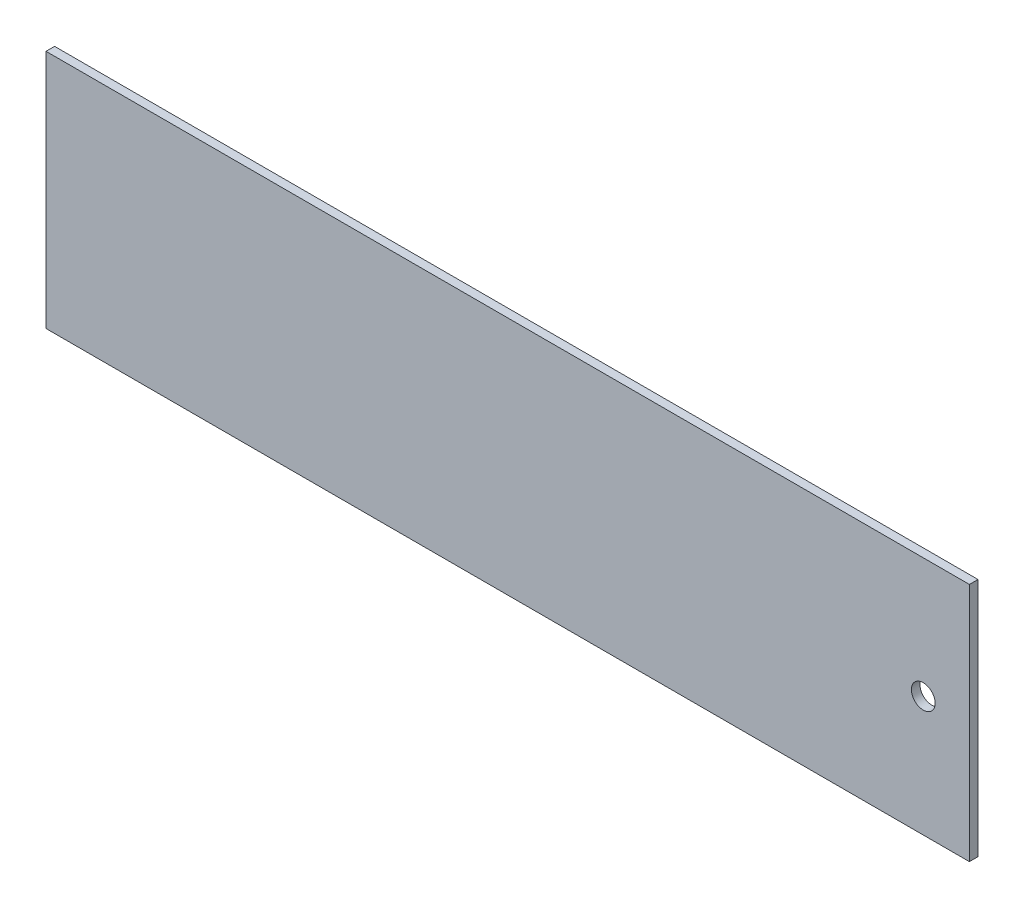
ISO-10303-21;
HEADER;
FILE_DESCRIPTION(('STEP AP214'),'2;1');
FILE_NAME('part.step','',(''),(''),'','','');
FILE_SCHEMA(('AUTOMOTIVE_DESIGN { 1 0 10303 214 1 1 1 1 }'));
ENDSEC;
DATA;
#1=APPLICATION_CONTEXT('core data for automotive mechanical design processes');
#2=APPLICATION_PROTOCOL_DEFINITION('international standard','automotive_design',2000,#1);
#3=PRODUCT_CONTEXT('',#1,'mechanical');
#4=PRODUCT('Part','Part','',(#3));
#5=PRODUCT_RELATED_PRODUCT_CATEGORY('part','',(#4));
#6=PRODUCT_DEFINITION_FORMATION('','',#4);
#7=PRODUCT_DEFINITION_CONTEXT('part definition',#1,'design');
#8=PRODUCT_DEFINITION('design','',#6,#7);
#9=PRODUCT_DEFINITION_SHAPE('','',#8);
#10=(LENGTH_UNIT() NAMED_UNIT(*) SI_UNIT(.MILLI.,.METRE.));
#11=(NAMED_UNIT(*) PLANE_ANGLE_UNIT() SI_UNIT($,.RADIAN.));
#12=(NAMED_UNIT(*) SI_UNIT($,.STERADIAN.) SOLID_ANGLE_UNIT());
#13=UNCERTAINTY_MEASURE_WITH_UNIT(LENGTH_MEASURE(1.E-05),#10,'distance_accuracy_value','');
#14=(GEOMETRIC_REPRESENTATION_CONTEXT(3) GLOBAL_UNCERTAINTY_ASSIGNED_CONTEXT((#13)) GLOBAL_UNIT_ASSIGNED_CONTEXT((#10,
#11,#12)) REPRESENTATION_CONTEXT('',''));
#15=CARTESIAN_POINT('',(0.,0.,0.));
#16=DIRECTION('',(0.,0.,1.));
#17=DIRECTION('',(1.,0.,0.));
#18=AXIS2_PLACEMENT_3D('',#15,#16,#17);
#19=CARTESIAN_POINT('',(0.,0.,2.3622));
#20=DIRECTION('',(-1.,0.,0.));
#21=DIRECTION('',(0.,0.,1.));
#22=AXIS2_PLACEMENT_3D('',#19,#20,#21);
#23=PLANE('',#22);
#24=DIRECTION('',(0.,1.,0.));
#25=VECTOR('',#24,1.);
#26=CARTESIAN_POINT('',(0.,0.,0.));
#27=LINE('',#26,#25);
#28=CARTESIAN_POINT('',(0.,0.,0.));
#29=VERTEX_POINT('',#28);
#30=CARTESIAN_POINT('',(0.,66.04,0.));
#31=VERTEX_POINT('',#30);
#32=EDGE_CURVE('E105',#29,#31,#27,.T.);
#33=ORIENTED_EDGE('',*,*,#32,.T.);
#34=DIRECTION('',(0.,0.,-1.));
#35=VECTOR('',#34,1.);
#36=CARTESIAN_POINT('',(0.,66.04,2.3622));
#37=LINE('',#36,#35);
#38=CARTESIAN_POINT('',(0.,66.04,2.3622));
#39=VERTEX_POINT('',#38);
#40=EDGE_CURVE('E11',#39,#31,#37,.T.);
#41=ORIENTED_EDGE('',*,*,#40,.F.);
#42=DIRECTION('',(0.,1.,0.));
#43=VECTOR('',#42,1.);
#44=CARTESIAN_POINT('',(0.,0.,2.3622));
#45=LINE('',#44,#43);
#46=CARTESIAN_POINT('',(0.,0.,2.3622));
#47=VERTEX_POINT('',#46);
#48=EDGE_CURVE('E93',#47,#39,#45,.T.);
#49=ORIENTED_EDGE('',*,*,#48,.F.);
#50=DIRECTION('',(0.,0.,-1.));
#51=VECTOR('',#50,1.);
#52=CARTESIAN_POINT('',(0.,0.,2.3622));
#53=LINE('',#52,#51);
#54=EDGE_CURVE('E101',#47,#29,#53,.T.);
#55=ORIENTED_EDGE('',*,*,#54,.T.);
#56=EDGE_LOOP('',(#33,#41,#49,#55));
#57=FACE_BOUND('',#56,.T.);
#58=ADVANCED_FACE('F42',(#57),#23,.F.);
#59=CARTESIAN_POINT('',(0.,66.04,2.3622));
#60=DIRECTION('',(0.,-1.,0.));
#61=DIRECTION('',(1.,0.,0.));
#62=AXIS2_PLACEMENT_3D('',#59,#60,#61);
#63=PLANE('',#62);
#64=DIRECTION('',(-1.,0.,0.));
#65=VECTOR('',#64,1.);
#66=CARTESIAN_POINT('',(0.,66.04,0.));
#67=LINE('',#66,#65);
#68=CARTESIAN_POINT('',(-254.,66.04,0.));
#69=VERTEX_POINT('',#68);
#70=EDGE_CURVE('E97',#31,#69,#67,.T.);
#71=ORIENTED_EDGE('',*,*,#70,.T.);
#72=DIRECTION('',(0.,0.,-1.));
#73=VECTOR('',#72,1.);
#74=CARTESIAN_POINT('',(-254.,66.04,2.3622));
#75=LINE('',#74,#73);
#76=CARTESIAN_POINT('',(-254.,66.04,2.3622));
#77=VERTEX_POINT('',#76);
#78=EDGE_CURVE('E50',#77,#69,#75,.T.);
#79=ORIENTED_EDGE('',*,*,#78,.F.);
#80=DIRECTION('',(-1.,0.,0.));
#81=VECTOR('',#80,1.);
#82=CARTESIAN_POINT('',(0.,66.04,2.3622));
#83=LINE('',#82,#81);
#84=EDGE_CURVE('E88',#39,#77,#83,.T.);
#85=ORIENTED_EDGE('',*,*,#84,.F.);
#86=ORIENTED_EDGE('',*,*,#40,.T.);
#87=EDGE_LOOP('',(#71,#79,#85,#86));
#88=FACE_BOUND('',#87,.T.);
#89=ADVANCED_FACE('F96',(#88),#63,.F.);
#90=CARTESIAN_POINT('',(-254.,0.,2.3622));
#91=DIRECTION('',(1.,0.,0.));
#92=DIRECTION('',(0.,0.,-1.));
#93=AXIS2_PLACEMENT_3D('',#90,#91,#92);
#94=PLANE('',#93);
#95=DIRECTION('',(0.,-1.,0.));
#96=VECTOR('',#95,1.);
#97=CARTESIAN_POINT('',(-254.,0.,0.));
#98=LINE('',#97,#96);
#99=CARTESIAN_POINT('',(-254.,0.,0.));
#100=VERTEX_POINT('',#99);
#101=EDGE_CURVE('E75',#69,#100,#98,.T.);
#102=ORIENTED_EDGE('',*,*,#101,.T.);
#103=DIRECTION('',(0.,0.,-1.));
#104=VECTOR('',#103,1.);
#105=CARTESIAN_POINT('',(-254.,0.,2.3622));
#106=LINE('',#105,#104);
#107=CARTESIAN_POINT('',(-254.,0.,2.3622));
#108=VERTEX_POINT('',#107);
#109=EDGE_CURVE('E98',#108,#100,#106,.T.);
#110=ORIENTED_EDGE('',*,*,#109,.F.);
#111=DIRECTION('',(0.,-1.,0.));
#112=VECTOR('',#111,1.);
#113=CARTESIAN_POINT('',(-254.,0.,2.3622));
#114=LINE('',#113,#112);
#115=EDGE_CURVE('E91',#77,#108,#114,.T.);
#116=ORIENTED_EDGE('',*,*,#115,.F.);
#117=ORIENTED_EDGE('',*,*,#78,.T.);
#118=EDGE_LOOP('',(#102,#110,#116,#117));
#119=FACE_BOUND('',#118,.T.);
#120=ADVANCED_FACE('F99',(#119),#94,.F.);
#121=CARTESIAN_POINT('',(0.,0.,2.3622));
#122=DIRECTION('',(0.,1.,0.));
#123=DIRECTION('',(-1.,0.,0.));
#124=AXIS2_PLACEMENT_3D('',#121,#122,#123);
#125=PLANE('',#124);
#126=DIRECTION('',(1.,0.,0.));
#127=VECTOR('',#126,1.);
#128=CARTESIAN_POINT('',(0.,0.,0.));
#129=LINE('',#128,#127);
#130=EDGE_CURVE('E81',#100,#29,#129,.T.);
#131=ORIENTED_EDGE('',*,*,#130,.T.);
#132=ORIENTED_EDGE('',*,*,#54,.F.);
#133=DIRECTION('',(1.,0.,0.));
#134=VECTOR('',#133,1.);
#135=CARTESIAN_POINT('',(0.,0.,2.3622));
#136=LINE('',#135,#134);
#137=EDGE_CURVE('E58',#108,#47,#136,.T.);
#138=ORIENTED_EDGE('',*,*,#137,.F.);
#139=ORIENTED_EDGE('',*,*,#109,.T.);
#140=EDGE_LOOP('',(#131,#132,#138,#139));
#141=FACE_BOUND('',#140,.T.);
#142=ADVANCED_FACE('F113',(#141),#125,.F.);
#143=CARTESIAN_POINT('',(0.,0.,2.3622));
#144=DIRECTION('',(0.,0.,1.));
#145=DIRECTION('',(1.,0.,0.));
#146=AXIS2_PLACEMENT_3D('',#143,#144,#145);
#147=PLANE('',#146);
#148=CARTESIAN_POINT('',(-12.7,33.02,2.3622));
#149=DIRECTION('',(0.,0.,1.));
#150=DIRECTION('',(1.,0.,0.));
#151=AXIS2_PLACEMENT_3D('',#148,#149,#150);
#152=CIRCLE('',#151,3.2639);
#153=CARTESIAN_POINT('',(-9.4361,33.02,2.3622));
#154=VERTEX_POINT('',#153);
#155=EDGE_CURVE('E119',#154,#154,#152,.T.);
#156=ORIENTED_EDGE('',*,*,#155,.F.);
#157=EDGE_LOOP('',(#156));
#158=FACE_BOUND('',#157,.T.);
#159=ORIENTED_EDGE('',*,*,#48,.T.);
#160=ORIENTED_EDGE('',*,*,#84,.T.);
#161=ORIENTED_EDGE('',*,*,#115,.T.);
#162=ORIENTED_EDGE('',*,*,#137,.T.);
#163=EDGE_LOOP('',(#159,#160,#161,#162));
#164=FACE_BOUND('',#163,.T.);
#165=ADVANCED_FACE('F89',(#158,#164),#147,.T.);
#166=CARTESIAN_POINT('',(0.,0.,0.));
#167=DIRECTION('',(0.,0.,1.));
#168=DIRECTION('',(1.,0.,0.));
#169=AXIS2_PLACEMENT_3D('',#166,#167,#168);
#170=PLANE('',#169);
#171=CARTESIAN_POINT('',(-12.7,33.02,0.));
#172=DIRECTION('',(0.,0.,1.));
#173=DIRECTION('',(1.,0.,0.));
#174=AXIS2_PLACEMENT_3D('',#171,#172,#173);
#175=CIRCLE('',#174,3.2639);
#176=CARTESIAN_POINT('',(-9.4361,33.02,0.));
#177=VERTEX_POINT('',#176);
#178=EDGE_CURVE('E108',#177,#177,#175,.T.);
#179=ORIENTED_EDGE('',*,*,#178,.T.);
#180=EDGE_LOOP('',(#179));
#181=FACE_BOUND('',#180,.T.);
#182=ORIENTED_EDGE('',*,*,#32,.F.);
#183=ORIENTED_EDGE('',*,*,#130,.F.);
#184=ORIENTED_EDGE('',*,*,#101,.F.);
#185=ORIENTED_EDGE('',*,*,#70,.F.);
#186=EDGE_LOOP('',(#182,#183,#184,#185));
#187=FACE_BOUND('',#186,.T.);
#188=ADVANCED_FACE('F116',(#181,#187),#170,.F.);
#189=CARTESIAN_POINT('',(-12.7,33.02,0.));
#190=DIRECTION('',(0.,0.,1.));
#191=DIRECTION('',(1.,0.,0.));
#192=AXIS2_PLACEMENT_3D('',#189,#190,#191);
#193=CYLINDRICAL_SURFACE('',#192,3.2639);
#194=ORIENTED_EDGE('',*,*,#178,.F.);
#195=EDGE_LOOP('',(#194));
#196=FACE_BOUND('',#195,.T.);
#197=ORIENTED_EDGE('',*,*,#155,.T.);
#198=EDGE_LOOP('',(#197));
#199=FACE_BOUND('',#198,.T.);
#200=ADVANCED_FACE('F126',(#196,#199),#193,.F.);
#201=CLOSED_SHELL('',(#58,#89,#120,#142,#165,#188,#200));
#202=MANIFOLD_SOLID_BREP('B2',#201);
#203=ADVANCED_BREP_SHAPE_REPRESENTATION('',(#18,#202),#14);
#204=SHAPE_DEFINITION_REPRESENTATION(#9,#203);
ENDSEC;
END-ISO-10303-21;
